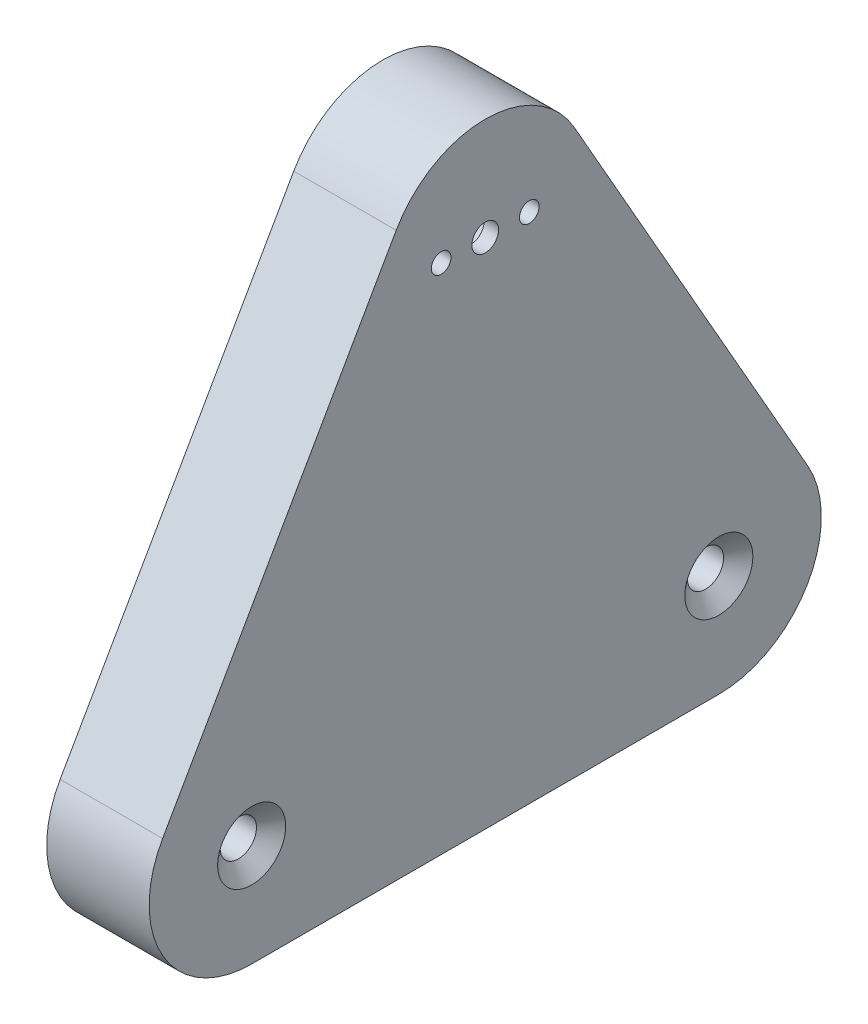
ISO-10303-21;
HEADER;
FILE_DESCRIPTION(('STEP AP214'),'2;1');
FILE_NAME('part.step','',(''),(''),'','','');
FILE_SCHEMA(('AUTOMOTIVE_DESIGN { 1 0 10303 214 1 1 1 1 }'));
ENDSEC;
DATA;
#1=APPLICATION_CONTEXT('core data for automotive mechanical design processes');
#2=APPLICATION_PROTOCOL_DEFINITION('international standard','automotive_design',2000,#1);
#3=PRODUCT_CONTEXT('',#1,'mechanical');
#4=PRODUCT('Part','Part','',(#3));
#5=PRODUCT_RELATED_PRODUCT_CATEGORY('part','',(#4));
#6=PRODUCT_DEFINITION_FORMATION('','',#4);
#7=PRODUCT_DEFINITION_CONTEXT('part definition',#1,'design');
#8=PRODUCT_DEFINITION('design','',#6,#7);
#9=PRODUCT_DEFINITION_SHAPE('','',#8);
#10=(LENGTH_UNIT() NAMED_UNIT(*) SI_UNIT(.MILLI.,.METRE.));
#11=(NAMED_UNIT(*) PLANE_ANGLE_UNIT() SI_UNIT($,.RADIAN.));
#12=(NAMED_UNIT(*) SI_UNIT($,.STERADIAN.) SOLID_ANGLE_UNIT());
#13=UNCERTAINTY_MEASURE_WITH_UNIT(LENGTH_MEASURE(1.E-05),#10,'distance_accuracy_value','');
#14=(GEOMETRIC_REPRESENTATION_CONTEXT(3) GLOBAL_UNCERTAINTY_ASSIGNED_CONTEXT((#13)) GLOBAL_UNIT_ASSIGNED_CONTEXT((#10,
#11,#12)) REPRESENTATION_CONTEXT('',''));
#15=CARTESIAN_POINT('',(0.,0.,0.));
#16=DIRECTION('',(0.,0.,1.));
#17=DIRECTION('',(1.,0.,0.));
#18=AXIS2_PLACEMENT_3D('',#15,#16,#17);
#19=CARTESIAN_POINT('',(3.175,25.4,0.));
#20=DIRECTION('',(1.,0.,0.));
#21=DIRECTION('',(0.,0.,-1.));
#22=AXIS2_PLACEMENT_3D('',#19,#20,#21);
#23=CYLINDRICAL_SURFACE('',#22,12.7);
#24=CARTESIAN_POINT('',(15.875,25.4,0.));
#25=DIRECTION('',(1.,0.,0.));
#26=DIRECTION('',(0.,0.,-1.));
#27=AXIS2_PLACEMENT_3D('',#24,#25,#26);
#28=CIRCLE('',#27,12.7);
#29=CARTESIAN_POINT('',(15.875,31.6874978115392,-11.034372264424));
#30=VERTEX_POINT('',#29);
#31=CARTESIAN_POINT('',(15.875,31.6874978115392,11.034372264424));
#32=VERTEX_POINT('',#31);
#33=EDGE_CURVE('E95',#30,#32,#28,.T.);
#34=ORIENTED_EDGE('',*,*,#33,.F.);
#35=DIRECTION('',(1.,0.,0.));
#36=VECTOR('',#35,1.);
#37=CARTESIAN_POINT('',(-77.1468525682768,31.6874978115392,-11.034372264424));
#38=LINE('',#37,#36);
#39=CARTESIAN_POINT('',(3.175,31.6874978115392,-11.034372264424));
#40=VERTEX_POINT('',#39);
#41=EDGE_CURVE('E99',#40,#30,#38,.T.);
#42=ORIENTED_EDGE('',*,*,#41,.F.);
#43=CARTESIAN_POINT('',(3.175,25.4,0.));
#44=DIRECTION('',(1.,0.,0.));
#45=DIRECTION('',(0.,0.,-1.));
#46=AXIS2_PLACEMENT_3D('',#43,#44,#45);
#47=CIRCLE('',#46,12.7);
#48=CARTESIAN_POINT('',(3.175,31.6874978115392,11.034372264424));
#49=VERTEX_POINT('',#48);
#50=EDGE_CURVE('E112',#40,#49,#47,.T.);
#51=ORIENTED_EDGE('',*,*,#50,.T.);
#52=DIRECTION('',(1.,0.,0.));
#53=VECTOR('',#52,1.);
#54=CARTESIAN_POINT('',(-77.1468525682768,31.6874978115392,11.034372264424));
#55=LINE('',#54,#53);
#56=EDGE_CURVE('E111',#49,#32,#55,.T.);
#57=ORIENTED_EDGE('',*,*,#56,.T.);
#58=EDGE_LOOP('',(#34,#42,#51,#57));
#59=FACE_BOUND('',#58,.T.);
#60=ADVANCED_FACE('F39',(#59),#23,.T.);
#61=CARTESIAN_POINT('',(39.2236659147798,25.4,0.));
#62=DIRECTION('',(-1.,0.,0.));
#63=DIRECTION('',(0.,0.,1.));
#64=AXIS2_PLACEMENT_3D('',#61,#62,#63);
#65=CYLINDRICAL_SURFACE('',#64,8.255);
#66=CARTESIAN_POINT('',(11.5377722,25.4,0.));
#67=DIRECTION('',(-1.,0.,0.));
#68=DIRECTION('',(0.,0.,1.));
#69=AXIS2_PLACEMENT_3D('',#66,#67,#68);
#70=CIRCLE('',#69,8.255);
#71=CARTESIAN_POINT('',(11.5377722,25.4,8.255));
#72=VERTEX_POINT('',#71);
#73=EDGE_CURVE('E127',#72,#72,#70,.F.);
#74=CARTESIAN_POINT('',(8.36277220000001,25.4,0.));
#75=DIRECTION('',(-1.,0.,0.));
#76=DIRECTION('',(0.,0.,1.));
#77=AXIS2_PLACEMENT_3D('',#74,#75,#76);
#78=CIRCLE('',#77,8.255);
#79=CARTESIAN_POINT('',(8.36277220000001,25.4,8.255));
#80=VERTEX_POINT('',#79);
#81=EDGE_CURVE('E128',#80,#80,#78,.F.);
#82=CARTESIAN_POINT('',(11.5377722,25.4,8.255));
#83=CARTESIAN_POINT('',(11.5046992833333,25.4,8.255));
#84=CARTESIAN_POINT('',(11.4716263666667,25.4,8.255));
#85=CARTESIAN_POINT('',(11.4054805333333,25.4,8.255));
#86=CARTESIAN_POINT('',(11.3724076166667,25.4,8.255));
#87=CARTESIAN_POINT('',(11.3062617833333,25.4,8.255));
#88=CARTESIAN_POINT('',(11.2731888666667,25.4,8.255));
#89=CARTESIAN_POINT('',(11.2070430333333,25.4,8.255));
#90=CARTESIAN_POINT('',(11.1739701166667,25.4,8.255));
#91=CARTESIAN_POINT('',(11.1078242833333,25.4,8.255));
#92=CARTESIAN_POINT('',(11.0747513666667,25.4,8.255));
#93=CARTESIAN_POINT('',(11.0086055333333,25.4,8.255));
#94=CARTESIAN_POINT('',(10.9755326166667,25.4,8.255));
#95=CARTESIAN_POINT('',(10.9093867833333,25.4,8.255));
#96=CARTESIAN_POINT('',(10.8763138666667,25.4,8.255));
#97=CARTESIAN_POINT('',(10.8101680333333,25.4,8.255));
#98=CARTESIAN_POINT('',(10.7770951166667,25.4,8.255));
#99=CARTESIAN_POINT('',(10.7109492833333,25.4,8.255));
#100=CARTESIAN_POINT('',(10.6778763666667,25.4,8.255));
#101=CARTESIAN_POINT('',(10.6117305333333,25.4,8.255));
#102=CARTESIAN_POINT('',(10.5786576166667,25.4,8.255));
#103=CARTESIAN_POINT('',(10.5125117833333,25.4,8.255));
#104=CARTESIAN_POINT('',(10.4794388666667,25.4,8.255));
#105=CARTESIAN_POINT('',(10.4132930333333,25.4,8.255));
#106=CARTESIAN_POINT('',(10.3802201166667,25.4,8.255));
#107=CARTESIAN_POINT('',(10.3140742833333,25.4,8.255));
#108=CARTESIAN_POINT('',(10.2810013666667,25.4,8.255));
#109=CARTESIAN_POINT('',(10.2148555333333,25.4,8.255));
#110=CARTESIAN_POINT('',(10.1817826166667,25.4,8.255));
#111=CARTESIAN_POINT('',(10.1156367833333,25.4,8.255));
#112=CARTESIAN_POINT('',(10.0825638666667,25.4,8.255));
#113=CARTESIAN_POINT('',(10.0164180333333,25.4,8.255));
#114=CARTESIAN_POINT('',(9.98334511666667,25.4,8.255));
#115=CARTESIAN_POINT('',(9.91719928333334,25.4,8.255));
#116=CARTESIAN_POINT('',(9.88412636666667,25.4,8.255));
#117=CARTESIAN_POINT('',(9.81798053333334,25.4,8.255));
#118=CARTESIAN_POINT('',(9.78490761666667,25.4,8.255));
#119=CARTESIAN_POINT('',(9.71876178333334,25.4,8.255));
#120=CARTESIAN_POINT('',(9.68568886666667,25.4,8.255));
#121=CARTESIAN_POINT('',(9.61954303333334,25.4,8.255));
#122=CARTESIAN_POINT('',(9.58647011666667,25.4,8.255));
#123=CARTESIAN_POINT('',(9.52032428333334,25.4,8.255));
#124=CARTESIAN_POINT('',(9.48725136666667,25.4,8.255));
#125=CARTESIAN_POINT('',(9.42110553333334,25.4,8.255));
#126=CARTESIAN_POINT('',(9.38803261666667,25.4,8.255));
#127=CARTESIAN_POINT('',(9.32188678333334,25.4,8.255));
#128=CARTESIAN_POINT('',(9.28881386666667,25.4,8.255));
#129=CARTESIAN_POINT('',(9.22266803333334,25.4,8.255));
#130=CARTESIAN_POINT('',(9.18959511666667,25.4,8.255));
#131=CARTESIAN_POINT('',(9.12344928333334,25.4,8.255));
#132=CARTESIAN_POINT('',(9.09037636666667,25.4,8.255));
#133=CARTESIAN_POINT('',(9.02423053333334,25.4,8.255));
#134=CARTESIAN_POINT('',(8.99115761666667,25.4,8.255));
#135=CARTESIAN_POINT('',(8.92501178333334,25.4,8.255));
#136=CARTESIAN_POINT('',(8.89193886666667,25.4,8.255));
#137=CARTESIAN_POINT('',(8.82579303333334,25.4,8.255));
#138=CARTESIAN_POINT('',(8.79272011666667,25.4,8.255));
#139=CARTESIAN_POINT('',(8.72657428333334,25.4,8.255));
#140=CARTESIAN_POINT('',(8.69350136666667,25.4,8.255));
#141=CARTESIAN_POINT('',(8.62735553333334,25.4,8.255));
#142=CARTESIAN_POINT('',(8.59428261666667,25.4,8.255));
#143=CARTESIAN_POINT('',(8.52813678333334,25.4,8.255));
#144=CARTESIAN_POINT('',(8.49506386666667,25.4,8.255));
#145=CARTESIAN_POINT('',(8.42891803333334,25.4,8.255));
#146=CARTESIAN_POINT('',(8.39584511666667,25.4,8.255));
#147=CARTESIAN_POINT('',(8.36277220000001,25.4,8.255));
#148=B_SPLINE_CURVE_WITH_KNOTS('',3,(#82,#83,#84,#85,#86,#87,#88,#89,#90,#91,#92,#93,#94,#95,
#96,#97,#98,#99,#100,#101,#102,#103,#104,#105,#106,#107,#108,#109,#110,#111,#112,#113,#114,#115,
#116,#117,#118,#119,#120,#121,#122,#123,#124,#125,#126,#127,#128,#129,#130,#131,#132,#133,#134,
#135,#136,#137,#138,#139,#140,#141,#142,#143,#144,#145,#146,#147),.UNSPECIFIED.,.F.,.F.,(4,2,2,
2,2,2,2,2,2,2,2,2,2,2,2,2,2,2,2,2,2,2,2,2,2,2,2,2,2,2,2,2,4),(0.,0.0992187500000012,
0.198437499999999,0.29765625,0.396874999999998,0.496093749999999,0.5953125,0.694531249999998,
0.793749999999999,0.892968750000001,0.992187499999998,1.09140625,1.190625,1.28984375,1.3890625,
1.48828125,1.5875,1.68671875,1.7859375,1.88515625,1.984375,2.08359375,2.1828125,2.28203125,
2.38125,2.48046875,2.5796875,2.67890625,2.778125,2.87734375,2.9765625,3.07578125,3.175),.UNSPECIFIED.);
#149=EDGE_CURVE('BSEAM208',#72,#80,#148,.T.);
#150=ORIENTED_EDGE('',*,*,#73,.T.);
#151=ORIENTED_EDGE('',*,*,#81,.F.);
#152=ORIENTED_EDGE('',*,*,#149,.T.);
#153=ORIENTED_EDGE('',*,*,#149,.F.);
#154=EDGE_LOOP('',(#150,#152,#151,#153));
#155=FACE_BOUND('',#154,.T.);
#156=ADVANCED_FACE('F208',(#155),#65,.F.);
#157=CARTESIAN_POINT('',(26.651307345283,25.4,0.));
#158=DIRECTION('',(-1.,0.,0.));
#159=DIRECTION('',(0.,0.,1.));
#160=AXIS2_PLACEMENT_3D('',#157,#158,#159);
#161=CYLINDRICAL_SURFACE('',#160,3.81);
#162=CARTESIAN_POINT('',(14.0777722,25.4,0.));
#163=DIRECTION('',(-1.,0.,0.));
#164=DIRECTION('',(0.,0.,1.));
#165=AXIS2_PLACEMENT_3D('',#162,#163,#164);
#166=CIRCLE('',#165,3.81);
#167=CARTESIAN_POINT('',(14.0777722,25.4,3.81));
#168=VERTEX_POINT('',#167);
#169=EDGE_CURVE('E123',#168,#168,#166,.F.);
#170=CARTESIAN_POINT('',(11.5377722,25.4,0.));
#171=DIRECTION('',(-1.,0.,0.));
#172=DIRECTION('',(0.,0.,1.));
#173=AXIS2_PLACEMENT_3D('',#170,#171,#172);
#174=CIRCLE('',#173,3.81);
#175=CARTESIAN_POINT('',(11.5377722,25.4,3.81));
#176=VERTEX_POINT('',#175);
#177=EDGE_CURVE('E124',#176,#176,#174,.F.);
#178=CARTESIAN_POINT('',(14.0777722,25.4,3.81));
#179=CARTESIAN_POINT('',(14.0513138666667,25.4,3.81));
#180=CARTESIAN_POINT('',(14.0248555333333,25.4,3.81));
#181=CARTESIAN_POINT('',(13.9719388666667,25.4,3.81));
#182=CARTESIAN_POINT('',(13.9454805333333,25.4,3.81));
#183=CARTESIAN_POINT('',(13.8925638666667,25.4,3.81));
#184=CARTESIAN_POINT('',(13.8661055333333,25.4,3.81));
#185=CARTESIAN_POINT('',(13.8131888666667,25.4,3.81));
#186=CARTESIAN_POINT('',(13.7867305333333,25.4,3.81));
#187=CARTESIAN_POINT('',(13.7338138666667,25.4,3.81));
#188=CARTESIAN_POINT('',(13.7073555333333,25.4,3.81));
#189=CARTESIAN_POINT('',(13.6544388666667,25.4,3.81));
#190=CARTESIAN_POINT('',(13.6279805333333,25.4,3.81));
#191=CARTESIAN_POINT('',(13.5750638666667,25.4,3.81));
#192=CARTESIAN_POINT('',(13.5486055333333,25.4,3.81));
#193=CARTESIAN_POINT('',(13.4956888666667,25.4,3.81));
#194=CARTESIAN_POINT('',(13.4692305333333,25.4,3.81));
#195=CARTESIAN_POINT('',(13.4163138666667,25.4,3.81));
#196=CARTESIAN_POINT('',(13.3898555333333,25.4,3.81));
#197=CARTESIAN_POINT('',(13.3369388666667,25.4,3.81));
#198=CARTESIAN_POINT('',(13.3104805333333,25.4,3.81));
#199=CARTESIAN_POINT('',(13.2575638666667,25.4,3.81));
#200=CARTESIAN_POINT('',(13.2311055333333,25.4,3.81));
#201=CARTESIAN_POINT('',(13.1781888666667,25.4,3.81));
#202=CARTESIAN_POINT('',(13.1517305333333,25.4,3.81));
#203=CARTESIAN_POINT('',(13.0988138666667,25.4,3.81));
#204=CARTESIAN_POINT('',(13.0723555333333,25.4,3.81));
#205=CARTESIAN_POINT('',(13.0194388666667,25.4,3.81));
#206=CARTESIAN_POINT('',(12.9929805333333,25.4,3.81));
#207=CARTESIAN_POINT('',(12.9400638666667,25.4,3.81));
#208=CARTESIAN_POINT('',(12.9136055333333,25.4,3.81));
#209=CARTESIAN_POINT('',(12.8606888666667,25.4,3.81));
#210=CARTESIAN_POINT('',(12.8342305333333,25.4,3.81));
#211=CARTESIAN_POINT('',(12.7813138666667,25.4,3.81));
#212=CARTESIAN_POINT('',(12.7548555333333,25.4,3.81));
#213=CARTESIAN_POINT('',(12.7019388666667,25.4,3.81));
#214=CARTESIAN_POINT('',(12.6754805333333,25.4,3.81));
#215=CARTESIAN_POINT('',(12.6225638666667,25.4,3.81));
#216=CARTESIAN_POINT('',(12.5961055333333,25.4,3.81));
#217=CARTESIAN_POINT('',(12.5431888666667,25.4,3.81));
#218=CARTESIAN_POINT('',(12.5167305333333,25.4,3.81));
#219=CARTESIAN_POINT('',(12.4638138666667,25.4,3.81));
#220=CARTESIAN_POINT('',(12.4373555333333,25.4,3.81));
#221=CARTESIAN_POINT('',(12.3844388666667,25.4,3.81));
#222=CARTESIAN_POINT('',(12.3579805333333,25.4,3.81));
#223=CARTESIAN_POINT('',(12.3050638666667,25.4,3.81));
#224=CARTESIAN_POINT('',(12.2786055333333,25.4,3.81));
#225=CARTESIAN_POINT('',(12.2256888666667,25.4,3.81));
#226=CARTESIAN_POINT('',(12.1992305333333,25.4,3.81));
#227=CARTESIAN_POINT('',(12.1463138666667,25.4,3.81));
#228=CARTESIAN_POINT('',(12.1198555333333,25.4,3.81));
#229=CARTESIAN_POINT('',(12.0669388666667,25.4,3.81));
#230=CARTESIAN_POINT('',(12.0404805333333,25.4,3.81));
#231=CARTESIAN_POINT('',(11.9875638666667,25.4,3.81));
#232=CARTESIAN_POINT('',(11.9611055333333,25.4,3.81));
#233=CARTESIAN_POINT('',(11.9081888666667,25.4,3.81));
#234=CARTESIAN_POINT('',(11.8817305333333,25.4,3.81));
#235=CARTESIAN_POINT('',(11.8288138666667,25.4,3.81));
#236=CARTESIAN_POINT('',(11.8023555333333,25.4,3.81));
#237=CARTESIAN_POINT('',(11.7494388666667,25.4,3.81));
#238=CARTESIAN_POINT('',(11.7229805333333,25.4,3.81));
#239=CARTESIAN_POINT('',(11.6700638666667,25.4,3.81));
#240=CARTESIAN_POINT('',(11.6436055333333,25.4,3.81));
#241=CARTESIAN_POINT('',(11.5906888666667,25.4,3.81));
#242=CARTESIAN_POINT('',(11.5642305333333,25.4,3.81));
#243=CARTESIAN_POINT('',(11.5377722,25.4,3.81));
#244=B_SPLINE_CURVE_WITH_KNOTS('',3,(#178,#179,#180,#181,#182,#183,#184,#185,#186,#187,#188,
#189,#190,#191,#192,#193,#194,#195,#196,#197,#198,#199,#200,#201,#202,#203,#204,#205,#206,#207,
#208,#209,#210,#211,#212,#213,#214,#215,#216,#217,#218,#219,#220,#221,#222,#223,#224,#225,#226,
#227,#228,#229,#230,#231,#232,#233,#234,#235,#236,#237,#238,#239,#240,#241,#242,#243),
.UNSPECIFIED.,.F.,.F.,(4,2,2,2,2,2,2,2,2,2,2,2,2,2,2,2,2,2,2,2,2,2,2,2,2,2,2,2,2,2,2,2,4),(0.,
0.0793749999999996,0.158749999999999,0.238125,0.3175,0.396875,0.476249999999999,
0.555624999999999,0.635,0.714375,0.793749999999999,0.873124999999999,0.952499999999998,1.031875,
1.11125,1.190625,1.27,1.349375,1.42875,1.508125,1.5875,1.666875,1.74625,1.825625,1.905,1.984375,
2.06375,2.143125,2.2225,2.301875,2.38125,2.460625,2.54),.UNSPECIFIED.);
#245=EDGE_CURVE('BSEAM187',#168,#176,#244,.T.);
#246=ORIENTED_EDGE('',*,*,#169,.T.);
#247=ORIENTED_EDGE('',*,*,#177,.F.);
#248=ORIENTED_EDGE('',*,*,#245,.T.);
#249=ORIENTED_EDGE('',*,*,#245,.F.);
#250=EDGE_LOOP('',(#246,#248,#247,#249));
#251=FACE_BOUND('',#250,.T.);
#252=ADVANCED_FACE('F187',(#251),#161,.F.);
#253=CARTESIAN_POINT('',(20.544733182956,25.4,0.));
#254=DIRECTION('',(-1.,0.,0.));
#255=DIRECTION('',(0.,0.,1.));
#256=AXIS2_PLACEMENT_3D('',#253,#254,#255);
#257=CYLINDRICAL_SURFACE('',#256,1.651);
#258=CARTESIAN_POINT('',(15.875,25.4,0.));
#259=DIRECTION('',(-1.,0.,0.));
#260=DIRECTION('',(0.,0.,1.));
#261=AXIS2_PLACEMENT_3D('',#258,#259,#260);
#262=CIRCLE('',#261,1.651);
#263=CARTESIAN_POINT('',(15.875,25.4,1.651));
#264=VERTEX_POINT('',#263);
#265=EDGE_CURVE('E113',#264,#264,#262,.F.);
#266=CARTESIAN_POINT('',(14.0777722,25.4,0.));
#267=DIRECTION('',(-1.,0.,0.));
#268=DIRECTION('',(0.,0.,1.));
#269=AXIS2_PLACEMENT_3D('',#266,#267,#268);
#270=CIRCLE('',#269,1.651);
#271=CARTESIAN_POINT('',(14.0777722,25.4,1.651));
#272=VERTEX_POINT('',#271);
#273=EDGE_CURVE('E118',#272,#272,#270,.F.);
#274=CARTESIAN_POINT('',(15.875,25.4,1.651));
#275=CARTESIAN_POINT('',(15.8562788770833,25.4,1.651));
#276=CARTESIAN_POINT('',(15.8375577541667,25.4,1.651));
#277=CARTESIAN_POINT('',(15.8001155083333,25.4,1.651));
#278=CARTESIAN_POINT('',(15.7813943854167,25.4,1.651));
#279=CARTESIAN_POINT('',(15.7439521395833,25.4,1.651));
#280=CARTESIAN_POINT('',(15.7252310166667,25.4,1.651));
#281=CARTESIAN_POINT('',(15.6877887708333,25.4,1.651));
#282=CARTESIAN_POINT('',(15.6690676479167,25.4,1.651));
#283=CARTESIAN_POINT('',(15.6316254020833,25.4,1.651));
#284=CARTESIAN_POINT('',(15.6129042791667,25.4,1.651));
#285=CARTESIAN_POINT('',(15.5754620333333,25.4,1.651));
#286=CARTESIAN_POINT('',(15.5567409104167,25.4,1.651));
#287=CARTESIAN_POINT('',(15.5192986645833,25.4,1.651));
#288=CARTESIAN_POINT('',(15.5005775416667,25.4,1.651));
#289=CARTESIAN_POINT('',(15.4631352958333,25.4,1.651));
#290=CARTESIAN_POINT('',(15.4444141729167,25.4,1.651));
#291=CARTESIAN_POINT('',(15.4069719270833,25.4,1.651));
#292=CARTESIAN_POINT('',(15.3882508041667,25.4,1.651));
#293=CARTESIAN_POINT('',(15.3508085583333,25.4,1.651));
#294=CARTESIAN_POINT('',(15.3320874354167,25.4,1.651));
#295=CARTESIAN_POINT('',(15.2946451895833,25.4,1.651));
#296=CARTESIAN_POINT('',(15.2759240666667,25.4,1.651));
#297=CARTESIAN_POINT('',(15.2384818208333,25.4,1.651));
#298=CARTESIAN_POINT('',(15.2197606979167,25.4,1.651));
#299=CARTESIAN_POINT('',(15.1823184520833,25.4,1.651));
#300=CARTESIAN_POINT('',(15.1635973291667,25.4,1.651));
#301=CARTESIAN_POINT('',(15.1261550833333,25.4,1.651));
#302=CARTESIAN_POINT('',(15.1074339604167,25.4,1.651));
#303=CARTESIAN_POINT('',(15.0699917145833,25.4,1.651));
#304=CARTESIAN_POINT('',(15.0512705916667,25.4,1.651));
#305=CARTESIAN_POINT('',(15.0138283458333,25.4,1.651));
#306=CARTESIAN_POINT('',(14.9951072229167,25.4,1.651));
#307=CARTESIAN_POINT('',(14.9576649770833,25.4,1.651));
#308=CARTESIAN_POINT('',(14.9389438541667,25.4,1.651));
#309=CARTESIAN_POINT('',(14.9015016083333,25.4,1.651));
#310=CARTESIAN_POINT('',(14.8827804854167,25.4,1.651));
#311=CARTESIAN_POINT('',(14.8453382395833,25.4,1.651));
#312=CARTESIAN_POINT('',(14.8266171166667,25.4,1.651));
#313=CARTESIAN_POINT('',(14.7891748708333,25.4,1.651));
#314=CARTESIAN_POINT('',(14.7704537479167,25.4,1.651));
#315=CARTESIAN_POINT('',(14.7330115020833,25.4,1.651));
#316=CARTESIAN_POINT('',(14.7142903791667,25.4,1.651));
#317=CARTESIAN_POINT('',(14.6768481333333,25.4,1.651));
#318=CARTESIAN_POINT('',(14.6581270104167,25.4,1.651));
#319=CARTESIAN_POINT('',(14.6206847645833,25.4,1.651));
#320=CARTESIAN_POINT('',(14.6019636416667,25.4,1.651));
#321=CARTESIAN_POINT('',(14.5645213958333,25.4,1.651));
#322=CARTESIAN_POINT('',(14.5458002729167,25.4,1.651));
#323=CARTESIAN_POINT('',(14.5083580270833,25.4,1.651));
#324=CARTESIAN_POINT('',(14.4896369041667,25.4,1.651));
#325=CARTESIAN_POINT('',(14.4521946583333,25.4,1.651));
#326=CARTESIAN_POINT('',(14.4334735354167,25.4,1.651));
#327=CARTESIAN_POINT('',(14.3960312895833,25.4,1.651));
#328=CARTESIAN_POINT('',(14.3773101666667,25.4,1.651));
#329=CARTESIAN_POINT('',(14.3398679208333,25.4,1.651));
#330=CARTESIAN_POINT('',(14.3211467979167,25.4,1.651));
#331=CARTESIAN_POINT('',(14.2837045520833,25.4,1.651));
#332=CARTESIAN_POINT('',(14.2649834291667,25.4,1.651));
#333=CARTESIAN_POINT('',(14.2275411833333,25.4,1.651));
#334=CARTESIAN_POINT('',(14.2088200604167,25.4,1.651));
#335=CARTESIAN_POINT('',(14.1713778145833,25.4,1.651));
#336=CARTESIAN_POINT('',(14.1526566916667,25.4,1.651));
#337=CARTESIAN_POINT('',(14.1152144458333,25.4,1.651));
#338=CARTESIAN_POINT('',(14.0964933229167,25.4,1.651));
#339=CARTESIAN_POINT('',(14.0777722,25.4,1.651));
#340=B_SPLINE_CURVE_WITH_KNOTS('',3,(#274,#275,#276,#277,#278,#279,#280,#281,#282,#283,#284,
#285,#286,#287,#288,#289,#290,#291,#292,#293,#294,#295,#296,#297,#298,#299,#300,#301,#302,#303,
#304,#305,#306,#307,#308,#309,#310,#311,#312,#313,#314,#315,#316,#317,#318,#319,#320,#321,#322,
#323,#324,#325,#326,#327,#328,#329,#330,#331,#332,#333,#334,#335,#336,#337,#338,#339),
.UNSPECIFIED.,.F.,.F.,(4,2,2,2,2,2,2,2,2,2,2,2,2,2,2,2,2,2,2,2,2,2,2,2,2,2,2,2,2,2,2,2,4),(0.,
0.0561633687500007,0.112326737500001,0.168490106250002,0.224653475000003,0.280816843750002,
0.336980212500003,0.393143581250002,0.449306950000002,0.505470318750003,0.561633687500002,
0.617797056250003,0.673960425000002,0.730123793750002,0.786287162500003,0.842450531250004,
0.898613900000003,0.954777268750002,1.0109406375,1.06710400625,1.123267375,1.17943074375,
1.2355941125,1.29175748125,1.34792085,1.40408421875,1.4602475875,1.51641095625,1.572574325,
1.62873769375,1.6849010625,1.74106443125,1.7972278),.UNSPECIFIED.);
#341=EDGE_CURVE('BSEAM197',#264,#272,#340,.T.);
#342=ORIENTED_EDGE('',*,*,#265,.T.);
#343=ORIENTED_EDGE('',*,*,#273,.F.);
#344=ORIENTED_EDGE('',*,*,#341,.T.);
#345=ORIENTED_EDGE('',*,*,#341,.F.);
#346=EDGE_LOOP('',(#342,#344,#343,#345));
#347=FACE_BOUND('',#346,.T.);
#348=ADVANCED_FACE('F197',(#347),#257,.F.);
#349=CARTESIAN_POINT('',(15.875,-29.9528900942797,0.));
#350=DIRECTION('',(-1.,0.,0.));
#351=DIRECTION('',(0.,0.,1.));
#352=AXIS2_PLACEMENT_3D('',#349,#350,#351);
#353=PLANE('',#352);
#354=CARTESIAN_POINT('',(15.875,-25.4,-28.9463579052872));
#355=DIRECTION('',(1.,0.,0.));
#356=DIRECTION('',(0.,0.,-1.));
#357=AXIS2_PLACEMENT_3D('',#354,#355,#356);
#358=CIRCLE('',#357,4.2164);
#359=CARTESIAN_POINT('',(15.875,-25.4,-33.1627579052872));
#360=VERTEX_POINT('',#359);
#361=EDGE_CURVE('E364',#360,#360,#358,.T.);
#362=ORIENTED_EDGE('',*,*,#361,.F.);
#363=EDGE_LOOP('',(#362));
#364=FACE_BOUND('',#363,.T.);
#365=CARTESIAN_POINT('',(15.875,-25.4,28.9463579052872));
#366=DIRECTION('',(1.,0.,0.));
#367=DIRECTION('',(0.,0.,-1.));
#368=AXIS2_PLACEMENT_3D('',#365,#366,#367);
#369=CIRCLE('',#368,4.2164);
#370=CARTESIAN_POINT('',(15.875,-25.4,24.7299579052872));
#371=VERTEX_POINT('',#370);
#372=EDGE_CURVE('E371',#371,#371,#369,.T.);
#373=ORIENTED_EDGE('',*,*,#372,.F.);
#374=EDGE_LOOP('',(#373));
#375=FACE_BOUND('',#374,.T.);
#376=CARTESIAN_POINT('',(15.875,25.4,-5.4599967));
#377=DIRECTION('',(-1.,0.,0.));
#378=DIRECTION('',(0.,0.,1.));
#379=AXIS2_PLACEMENT_3D('',#376,#377,#378);
#380=CIRCLE('',#379,1.2192);
#381=CARTESIAN_POINT('',(15.875,25.4,-4.2407967));
#382=VERTEX_POINT('',#381);
#383=EDGE_CURVE('E164',#382,#382,#380,.F.);
#384=ORIENTED_EDGE('',*,*,#383,.F.);
#385=EDGE_LOOP('',(#384));
#386=FACE_BOUND('',#385,.T.);
#387=CARTESIAN_POINT('',(15.875,25.4,5.4599967));
#388=DIRECTION('',(-1.,0.,0.));
#389=DIRECTION('',(0.,0.,1.));
#390=AXIS2_PLACEMENT_3D('',#387,#388,#389);
#391=CIRCLE('',#390,1.2192);
#392=CARTESIAN_POINT('',(15.875,25.4,6.6791967));
#393=VERTEX_POINT('',#392);
#394=EDGE_CURVE('E174',#393,#393,#391,.F.);
#395=ORIENTED_EDGE('',*,*,#394,.F.);
#396=EDGE_LOOP('',(#395));
#397=FACE_BOUND('',#396,.T.);
#398=ORIENTED_EDGE('',*,*,#265,.F.);
#399=EDGE_LOOP('',(#398));
#400=FACE_BOUND('',#399,.T.);
#401=DIRECTION('',(0.,-0.868848209797166,0.495078567837732));
#402=VECTOR('',#401,1.);
#403=CARTESIAN_POINT('',(15.875,12.5131086351786,21.9601346997429));
#404=LINE('',#403,#402);
#405=CARTESIAN_POINT('',(15.875,-19.1125021884608,39.9807301697112));
#406=VERTEX_POINT('',#405);
#407=EDGE_CURVE('E157',#32,#406,#404,.T.);
#408=ORIENTED_EDGE('',*,*,#407,.T.);
#409=CARTESIAN_POINT('',(15.875,-25.4,28.9463579052872));
#410=DIRECTION('',(-1.,0.,0.));
#411=DIRECTION('',(0.,0.,1.));
#412=AXIS2_PLACEMENT_3D('',#409,#410,#411);
#413=CIRCLE('',#412,12.7);
#414=CARTESIAN_POINT('',(15.875,-38.1,28.9463579052872));
#415=VERTEX_POINT('',#414);
#416=EDGE_CURVE('E135',#406,#415,#413,.F.);
#417=ORIENTED_EDGE('',*,*,#416,.T.);
#418=DIRECTION('',(0.,0.,1.));
#419=VECTOR('',#418,1.);
#420=CARTESIAN_POINT('',(15.875,-38.1,12.7));
#421=LINE('',#420,#419);
#422=CARTESIAN_POINT('',(15.875,-38.1,-28.9463579052872));
#423=VERTEX_POINT('',#422);
#424=EDGE_CURVE('E156',#423,#415,#421,.T.);
#425=ORIENTED_EDGE('',*,*,#424,.F.);
#426=CARTESIAN_POINT('',(15.875,-25.4,-28.9463579052872));
#427=DIRECTION('',(-1.,0.,0.));
#428=DIRECTION('',(0.,0.,1.));
#429=AXIS2_PLACEMENT_3D('',#426,#427,#428);
#430=CIRCLE('',#429,12.7);
#431=CARTESIAN_POINT('',(15.875,-19.1125021884608,-39.9807301697112));
#432=VERTEX_POINT('',#431);
#433=EDGE_CURVE('E98',#423,#432,#430,.F.);
#434=ORIENTED_EDGE('',*,*,#433,.T.);
#435=DIRECTION('',(0.,0.868848209797166,0.495078567837733));
#436=VECTOR('',#435,1.);
#437=CARTESIAN_POINT('',(15.875,12.5131086351786,-21.9601346997429));
#438=LINE('',#437,#436);
#439=EDGE_CURVE('E90',#432,#30,#438,.T.);
#440=ORIENTED_EDGE('',*,*,#439,.T.);
#441=ORIENTED_EDGE('',*,*,#33,.T.);
#442=EDGE_LOOP('',(#408,#417,#425,#434,#440,#441));
#443=FACE_BOUND('',#442,.T.);
#444=ADVANCED_FACE('F93',(#364,#375,#386,#397,#400,#443),#353,.F.);
#445=CARTESIAN_POINT('',(3.175,0.,0.));
#446=DIRECTION('',(1.,0.,0.));
#447=DIRECTION('',(0.,0.,-1.));
#448=AXIS2_PLACEMENT_3D('',#445,#446,#447);
#449=PLANE('',#448);
#450=CARTESIAN_POINT('',(3.175,-25.4,-28.9463579052872));
#451=DIRECTION('',(1.,0.,0.));
#452=DIRECTION('',(0.,0.,-1.));
#453=AXIS2_PLACEMENT_3D('',#450,#451,#452);
#454=CIRCLE('',#453,2.2479);
#455=CARTESIAN_POINT('',(3.175,-25.4,-31.1942579052872));
#456=VERTEX_POINT('',#455);
#457=EDGE_CURVE('E366',#456,#456,#454,.T.);
#458=ORIENTED_EDGE('',*,*,#457,.T.);
#459=EDGE_LOOP('',(#458));
#460=FACE_BOUND('',#459,.T.);
#461=CARTESIAN_POINT('',(3.175,-25.4,28.9463579052872));
#462=DIRECTION('',(1.,0.,0.));
#463=DIRECTION('',(0.,0.,-1.));
#464=AXIS2_PLACEMENT_3D('',#461,#462,#463);
#465=CIRCLE('',#464,2.2479);
#466=CARTESIAN_POINT('',(3.175,-25.4,26.6984579052872));
#467=VERTEX_POINT('',#466);
#468=EDGE_CURVE('E100',#467,#467,#465,.T.);
#469=ORIENTED_EDGE('',*,*,#468,.T.);
#470=EDGE_LOOP('',(#469));
#471=FACE_BOUND('',#470,.T.);
#472=DIRECTION('',(0.,0.,-1.));
#473=VECTOR('',#472,1.);
#474=CARTESIAN_POINT('',(3.175,-38.1,12.7));
#475=LINE('',#474,#473);
#476=CARTESIAN_POINT('',(3.175,-38.1,28.9463579052872));
#477=VERTEX_POINT('',#476);
#478=CARTESIAN_POINT('',(3.175,-38.1,-28.9463579052872));
#479=VERTEX_POINT('',#478);
#480=EDGE_CURVE('E147',#477,#479,#475,.T.);
#481=ORIENTED_EDGE('',*,*,#480,.F.);
#482=CARTESIAN_POINT('',(3.175,-25.4,28.9463579052872));
#483=DIRECTION('',(1.,0.,0.));
#484=DIRECTION('',(0.,0.,-1.));
#485=AXIS2_PLACEMENT_3D('',#482,#483,#484);
#486=CIRCLE('',#485,12.7);
#487=CARTESIAN_POINT('',(3.175,-19.1125021884608,39.9807301697112));
#488=VERTEX_POINT('',#487);
#489=EDGE_CURVE('E47',#477,#488,#486,.F.);
#490=ORIENTED_EDGE('',*,*,#489,.T.);
#491=DIRECTION('',(0.,0.868848209797166,-0.495078567837732));
#492=VECTOR('',#491,1.);
#493=CARTESIAN_POINT('',(3.175,12.5131086351786,21.9601346997429));
#494=LINE('',#493,#492);
#495=EDGE_CURVE('E146',#488,#49,#494,.T.);
#496=ORIENTED_EDGE('',*,*,#495,.T.);
#497=ORIENTED_EDGE('',*,*,#50,.F.);
#498=DIRECTION('',(0.,-0.868848209797166,-0.495078567837733));
#499=VECTOR('',#498,1.);
#500=CARTESIAN_POINT('',(3.175,12.5131086351786,-21.9601346997429));
#501=LINE('',#500,#499);
#502=CARTESIAN_POINT('',(3.175,-19.1125021884608,-39.9807301697112));
#503=VERTEX_POINT('',#502);
#504=EDGE_CURVE('E104',#40,#503,#501,.T.);
#505=ORIENTED_EDGE('',*,*,#504,.T.);
#506=CARTESIAN_POINT('',(3.175,-25.4,-28.9463579052872));
#507=DIRECTION('',(1.,0.,0.));
#508=DIRECTION('',(0.,0.,-1.));
#509=AXIS2_PLACEMENT_3D('',#506,#507,#508);
#510=CIRCLE('',#509,12.7);
#511=EDGE_CURVE('E59',#503,#479,#510,.F.);
#512=ORIENTED_EDGE('',*,*,#511,.T.);
#513=EDGE_LOOP('',(#481,#490,#496,#497,#505,#512));
#514=FACE_BOUND('',#513,.T.);
#515=CARTESIAN_POINT('',(3.175,25.4,0.));
#516=DIRECTION('',(-1.,0.,0.));
#517=DIRECTION('',(0.,0.,1.));
#518=AXIS2_PLACEMENT_3D('',#515,#516,#517);
#519=CIRCLE('',#518,9.525);
#520=CARTESIAN_POINT('',(3.175,25.4,9.525));
#521=VERTEX_POINT('',#520);
#522=EDGE_CURVE('E177',#521,#521,#519,.T.);
#523=ORIENTED_EDGE('',*,*,#522,.F.);
#524=EDGE_LOOP('',(#523));
#525=FACE_BOUND('',#524,.T.);
#526=ADVANCED_FACE('F144',(#460,#471,#514,#525),#449,.F.);
#527=CARTESIAN_POINT('',(14.0777722,-29.9528900942797,0.));
#528=DIRECTION('',(-1.,0.,0.));
#529=DIRECTION('',(0.,0.,1.));
#530=AXIS2_PLACEMENT_3D('',#527,#528,#529);
#531=PLANE('',#530);
#532=ORIENTED_EDGE('',*,*,#169,.F.);
#533=EDGE_LOOP('',(#532));
#534=FACE_BOUND('',#533,.T.);
#535=ORIENTED_EDGE('',*,*,#273,.T.);
#536=EDGE_LOOP('',(#535));
#537=FACE_BOUND('',#536,.T.);
#538=ADVANCED_FACE('F190',(#534,#537),#531,.T.);
#539=CARTESIAN_POINT('',(11.5377722,-29.9528900942797,0.));
#540=DIRECTION('',(-1.,0.,0.));
#541=DIRECTION('',(0.,0.,1.));
#542=AXIS2_PLACEMENT_3D('',#539,#540,#541);
#543=PLANE('',#542);
#544=CARTESIAN_POINT('',(11.5377722,25.4,-5.4599967));
#545=DIRECTION('',(-1.,0.,0.));
#546=DIRECTION('',(0.,0.,1.));
#547=AXIS2_PLACEMENT_3D('',#544,#545,#546);
#548=CIRCLE('',#547,1.2192);
#549=CARTESIAN_POINT('',(11.5377722,25.4,-4.2407967));
#550=VERTEX_POINT('',#549);
#551=EDGE_CURVE('E161',#550,#550,#548,.T.);
#552=ORIENTED_EDGE('',*,*,#551,.F.);
#553=EDGE_LOOP('',(#552));
#554=FACE_BOUND('',#553,.T.);
#555=CARTESIAN_POINT('',(11.5377722,25.4,5.4599967));
#556=DIRECTION('',(-1.,0.,0.));
#557=DIRECTION('',(0.,0.,1.));
#558=AXIS2_PLACEMENT_3D('',#555,#556,#557);
#559=CIRCLE('',#558,1.2192);
#560=CARTESIAN_POINT('',(11.5377722,25.4,6.6791967));
#561=VERTEX_POINT('',#560);
#562=EDGE_CURVE('E171',#561,#561,#559,.T.);
#563=ORIENTED_EDGE('',*,*,#562,.F.);
#564=EDGE_LOOP('',(#563));
#565=FACE_BOUND('',#564,.T.);
#566=ORIENTED_EDGE('',*,*,#73,.F.);
#567=EDGE_LOOP('',(#566));
#568=FACE_BOUND('',#567,.T.);
#569=ORIENTED_EDGE('',*,*,#177,.T.);
#570=EDGE_LOOP('',(#569));
#571=FACE_BOUND('',#570,.T.);
#572=ADVANCED_FACE('F193',(#554,#565,#568,#571),#543,.T.);
#573=CARTESIAN_POINT('',(8.36277220000001,-29.9528900942797,0.));
#574=DIRECTION('',(-1.,0.,0.));
#575=DIRECTION('',(0.,0.,1.));
#576=AXIS2_PLACEMENT_3D('',#573,#574,#575);
#577=PLANE('',#576);
#578=CARTESIAN_POINT('',(8.36277220000001,25.4,0.));
#579=DIRECTION('',(-1.,0.,0.));
#580=DIRECTION('',(0.,0.,1.));
#581=AXIS2_PLACEMENT_3D('',#578,#579,#580);
#582=CIRCLE('',#581,9.525);
#583=CARTESIAN_POINT('',(8.36277220000001,25.4,9.525));
#584=VERTEX_POINT('',#583);
#585=EDGE_CURVE('E131',#584,#584,#582,.F.);
#586=ORIENTED_EDGE('',*,*,#585,.F.);
#587=EDGE_LOOP('',(#586));
#588=FACE_BOUND('',#587,.T.);
#589=ORIENTED_EDGE('',*,*,#81,.T.);
#590=EDGE_LOOP('',(#589));
#591=FACE_BOUND('',#590,.T.);
#592=ADVANCED_FACE('F244',(#588,#591),#577,.T.);
#593=CARTESIAN_POINT('',(42.8157683632075,25.4,0.));
#594=DIRECTION('',(-1.,0.,0.));
#595=DIRECTION('',(0.,0.,1.));
#596=AXIS2_PLACEMENT_3D('',#593,#594,#595);
#597=CYLINDRICAL_SURFACE('',#596,9.525);
#598=CARTESIAN_POINT('',(8.36277220000001,25.4,9.525));
#599=CARTESIAN_POINT('',(8.30873290625001,25.4,9.525));
#600=CARTESIAN_POINT('',(8.25469361250001,25.4,9.525));
#601=CARTESIAN_POINT('',(8.14661502500001,25.4,9.525));
#602=CARTESIAN_POINT('',(8.09257573125002,25.4,9.525));
#603=CARTESIAN_POINT('',(7.98449714375001,25.4,9.525));
#604=CARTESIAN_POINT('',(7.93045785000001,25.4,9.525));
#605=CARTESIAN_POINT('',(7.82237926250001,25.4,9.525));
#606=CARTESIAN_POINT('',(7.76833996875001,25.4,9.525));
#607=CARTESIAN_POINT('',(7.66026138125001,25.4,9.525));
#608=CARTESIAN_POINT('',(7.60622208750001,25.4,9.525));
#609=CARTESIAN_POINT('',(7.49814350000002,25.4,9.525));
#610=CARTESIAN_POINT('',(7.44410420625001,25.4,9.525));
#611=CARTESIAN_POINT('',(7.33602561875002,25.4,9.525));
#612=CARTESIAN_POINT('',(7.28198632500001,25.4,9.525));
#613=CARTESIAN_POINT('',(7.17390773750002,25.4,9.525));
#614=CARTESIAN_POINT('',(7.11986844375001,25.4,9.525));
#615=CARTESIAN_POINT('',(7.01178985625001,25.4,9.525));
#616=CARTESIAN_POINT('',(6.95775056250001,25.4,9.525));
#617=CARTESIAN_POINT('',(6.84967197500001,25.4,9.525));
#618=CARTESIAN_POINT('',(6.79563268125001,25.4,9.525));
#619=CARTESIAN_POINT('',(6.68755409375001,25.4,9.525));
#620=CARTESIAN_POINT('',(6.63351480000001,25.4,9.525));
#621=CARTESIAN_POINT('',(6.52543621250001,25.4,9.525));
#622=CARTESIAN_POINT('',(6.47139691875001,25.4,9.525));
#623=CARTESIAN_POINT('',(6.36331833125001,25.4,9.525));
#624=CARTESIAN_POINT('',(6.30927903750001,25.4,9.525));
#625=CARTESIAN_POINT('',(6.20120045000001,25.4,9.525));
#626=CARTESIAN_POINT('',(6.14716115625001,25.4,9.525));
#627=CARTESIAN_POINT('',(6.03908256875001,25.4,9.525));
#628=CARTESIAN_POINT('',(5.98504327500001,25.4,9.525));
#629=CARTESIAN_POINT('',(5.87696468750001,25.4,9.525));
#630=CARTESIAN_POINT('',(5.82292539375001,25.4,9.525));
#631=CARTESIAN_POINT('',(5.71484680625001,25.4,9.525));
#632=CARTESIAN_POINT('',(5.66080751250001,25.4,9.525));
#633=CARTESIAN_POINT('',(5.55272892500001,25.4,9.525));
#634=CARTESIAN_POINT('',(5.49868963125001,25.4,9.525));
#635=CARTESIAN_POINT('',(5.39061104375001,25.4,9.525));
#636=CARTESIAN_POINT('',(5.33657175000001,25.4,9.525));
#637=CARTESIAN_POINT('',(5.22849316250001,25.4,9.525));
#638=CARTESIAN_POINT('',(5.17445386875001,25.4,9.525));
#639=CARTESIAN_POINT('',(5.06637528125001,25.4,9.525));
#640=CARTESIAN_POINT('',(5.01233598750001,25.4,9.525));
#641=CARTESIAN_POINT('',(4.90425740000001,25.4,9.525));
#642=CARTESIAN_POINT('',(4.85021810625001,25.4,9.525));
#643=CARTESIAN_POINT('',(4.74213951875001,25.4,9.525));
#644=CARTESIAN_POINT('',(4.68810022500001,25.4,9.525));
#645=CARTESIAN_POINT('',(4.58002163750001,25.4,9.525));
#646=CARTESIAN_POINT('',(4.52598234375001,25.4,9.525));
#647=CARTESIAN_POINT('',(4.41790375625001,25.4,9.525));
#648=CARTESIAN_POINT('',(4.36386446250001,25.4,9.525));
#649=CARTESIAN_POINT('',(4.25578587500001,25.4,9.525));
#650=CARTESIAN_POINT('',(4.20174658125001,25.4,9.525));
#651=CARTESIAN_POINT('',(4.09366799375,25.4,9.525));
#652=CARTESIAN_POINT('',(4.0396287,25.4,9.525));
#653=CARTESIAN_POINT('',(3.9315501125,25.4,9.525));
#654=CARTESIAN_POINT('',(3.87751081875,25.4,9.525));
#655=CARTESIAN_POINT('',(3.76943223125,25.4,9.525));
#656=CARTESIAN_POINT('',(3.7153929375,25.4,9.525));
#657=CARTESIAN_POINT('',(3.60731435,25.4,9.525));
#658=CARTESIAN_POINT('',(3.55327505625,25.4,9.525));
#659=CARTESIAN_POINT('',(3.44519646875,25.4,9.525));
#660=CARTESIAN_POINT('',(3.391157175,25.4,9.525));
#661=CARTESIAN_POINT('',(3.2830785875,25.4,9.525));
#662=CARTESIAN_POINT('',(3.22903929375,25.4,9.525));
#663=CARTESIAN_POINT('',(3.175,25.4,9.525));
#664=B_SPLINE_CURVE_WITH_KNOTS('',3,(#598,#599,#600,#601,#602,#603,#604,#605,#606,#607,#608,
#609,#610,#611,#612,#613,#614,#615,#616,#617,#618,#619,#620,#621,#622,#623,#624,#625,#626,#627,
#628,#629,#630,#631,#632,#633,#634,#635,#636,#637,#638,#639,#640,#641,#642,#643,#644,#645,#646,
#647,#648,#649,#650,#651,#652,#653,#654,#655,#656,#657,#658,#659,#660,#661,#662,#663),
.UNSPECIFIED.,.F.,.F.,(4,2,2,2,2,2,2,2,2,2,2,2,2,2,2,2,2,2,2,2,2,2,2,2,2,2,2,2,2,2,2,2,4),(0.,
0.16211788125,0.3242357625,0.48635364375,0.648471524999999,0.810589406249999,0.972707287499999,
1.13482516875,1.29694305,1.45906093125001,1.62117881250001,1.78329669375001,1.94541457500001,
2.10753245625001,2.26965033750001,2.43176821875001,2.59388610000001,2.75600398125,2.9181218625,
3.08023974375,3.242357625,3.40447550625,3.5665933875,3.72871126875,3.89082915000001,
4.05294703125,4.21506491250001,4.37718279375001,4.53930067500001,4.70141855625001,
4.86353643750001,5.02565431875001,5.18777220000001),.UNSPECIFIED.);
#665=EDGE_CURVE('BSEAM242',#584,#521,#664,.T.);
#666=ORIENTED_EDGE('',*,*,#585,.T.);
#667=ORIENTED_EDGE('',*,*,#522,.T.);
#668=ORIENTED_EDGE('',*,*,#665,.T.);
#669=ORIENTED_EDGE('',*,*,#665,.F.);
#670=EDGE_LOOP('',(#666,#668,#667,#669));
#671=FACE_BOUND('',#670,.T.);
#672=ADVANCED_FACE('F242',(#671),#597,.F.);
#673=CARTESIAN_POINT('',(19.3234183504906,25.4,5.4599967));
#674=DIRECTION('',(-1.,0.,0.));
#675=DIRECTION('',(0.,0.,1.));
#676=AXIS2_PLACEMENT_3D('',#673,#674,#675);
#677=CYLINDRICAL_SURFACE('',#676,1.2192);
#678=ORIENTED_EDGE('',*,*,#394,.T.);
#679=EDGE_LOOP('',(#678));
#680=FACE_BOUND('',#679,.T.);
#681=ORIENTED_EDGE('',*,*,#562,.T.);
#682=EDGE_LOOP('',(#681));
#683=FACE_BOUND('',#682,.T.);
#684=ADVANCED_FACE('F238',(#680,#683),#677,.F.);
#685=CARTESIAN_POINT('',(19.3234183504906,25.4,-5.4599967));
#686=DIRECTION('',(-1.,0.,0.));
#687=DIRECTION('',(0.,0.,1.));
#688=AXIS2_PLACEMENT_3D('',#685,#686,#687);
#689=CYLINDRICAL_SURFACE('',#688,1.2192);
#690=ORIENTED_EDGE('',*,*,#383,.T.);
#691=EDGE_LOOP('',(#690));
#692=FACE_BOUND('',#691,.T.);
#693=ORIENTED_EDGE('',*,*,#551,.T.);
#694=EDGE_LOOP('',(#693));
#695=FACE_BOUND('',#694,.T.);
#696=ADVANCED_FACE('F235',(#692,#695),#689,.F.);
#697=CARTESIAN_POINT('',(0.,-38.1,0.));
#698=DIRECTION('',(0.,-1.,0.));
#699=DIRECTION('',(0.,0.,-1.));
#700=AXIS2_PLACEMENT_3D('',#697,#698,#699);
#701=PLANE('',#700);
#702=ORIENTED_EDGE('',*,*,#424,.T.);
#703=DIRECTION('',(1.,0.,0.));
#704=VECTOR('',#703,1.);
#705=CARTESIAN_POINT('',(0.,-38.1,28.9463579052872));
#706=LINE('',#705,#704);
#707=EDGE_CURVE('E140',#415,#477,#706,.F.);
#708=ORIENTED_EDGE('',*,*,#707,.T.);
#709=ORIENTED_EDGE('',*,*,#480,.T.);
#710=DIRECTION('',(1.,0.,0.));
#711=VECTOR('',#710,1.);
#712=CARTESIAN_POINT('',(0.,-38.1,-28.9463579052872));
#713=LINE('',#712,#711);
#714=EDGE_CURVE('E137',#479,#423,#713,.T.);
#715=ORIENTED_EDGE('',*,*,#714,.T.);
#716=EDGE_LOOP('',(#702,#708,#709,#715));
#717=FACE_BOUND('',#716,.T.);
#718=ADVANCED_FACE('F159',(#717),#701,.T.);
#719=CARTESIAN_POINT('',(-77.1468525682768,12.5131086351786,21.9601346997429));
#720=DIRECTION('',(0.,0.495078567837732,0.868848209797166));
#721=DIRECTION('',(0.,-0.868848209797166,0.495078567837732));
#722=AXIS2_PLACEMENT_3D('',#719,#720,#721);
#723=PLANE('',#722);
#724=ORIENTED_EDGE('',*,*,#495,.F.);
#725=DIRECTION('',(1.,0.,0.));
#726=VECTOR('',#725,1.);
#727=CARTESIAN_POINT('',(-77.1468525682768,-19.1125021884608,39.9807301697112));
#728=LINE('',#727,#726);
#729=EDGE_CURVE('E115',#488,#406,#728,.T.);
#730=ORIENTED_EDGE('',*,*,#729,.T.);
#731=ORIENTED_EDGE('',*,*,#407,.F.);
#732=ORIENTED_EDGE('',*,*,#56,.F.);
#733=EDGE_LOOP('',(#724,#730,#731,#732));
#734=FACE_BOUND('',#733,.T.);
#735=ADVANCED_FACE('F152',(#734),#723,.T.);
#736=CARTESIAN_POINT('',(-77.1468525682768,12.5131086351786,-21.9601346997429));
#737=DIRECTION('',(0.,0.495078567837733,-0.868848209797166));
#738=DIRECTION('',(0.,0.868848209797166,0.495078567837733));
#739=AXIS2_PLACEMENT_3D('',#736,#737,#738);
#740=PLANE('',#739);
#741=ORIENTED_EDGE('',*,*,#439,.F.);
#742=DIRECTION('',(1.,0.,0.));
#743=VECTOR('',#742,1.);
#744=CARTESIAN_POINT('',(-77.1468525682768,-19.1125021884608,-39.9807301697112));
#745=LINE('',#744,#743);
#746=EDGE_CURVE('E12',#432,#503,#745,.F.);
#747=ORIENTED_EDGE('',*,*,#746,.T.);
#748=ORIENTED_EDGE('',*,*,#504,.F.);
#749=ORIENTED_EDGE('',*,*,#41,.T.);
#750=EDGE_LOOP('',(#741,#747,#748,#749));
#751=FACE_BOUND('',#750,.T.);
#752=ADVANCED_FACE('F103',(#751),#740,.T.);
#753=CARTESIAN_POINT('',(-77.1468525682768,-25.4,28.9463579052872));
#754=DIRECTION('',(1.,0.,0.));
#755=DIRECTION('',(0.,0.,-1.));
#756=AXIS2_PLACEMENT_3D('',#753,#754,#755);
#757=CYLINDRICAL_SURFACE('',#756,12.7);
#758=ORIENTED_EDGE('',*,*,#489,.F.);
#759=ORIENTED_EDGE('',*,*,#707,.F.);
#760=ORIENTED_EDGE('',*,*,#416,.F.);
#761=ORIENTED_EDGE('',*,*,#729,.F.);
#762=EDGE_LOOP('',(#758,#759,#760,#761));
#763=FACE_BOUND('',#762,.T.);
#764=ADVANCED_FACE('F154',(#763),#757,.T.);
#765=CARTESIAN_POINT('',(0.,-25.4,-28.9463579052872));
#766=DIRECTION('',(1.,0.,0.));
#767=DIRECTION('',(0.,0.,-1.));
#768=AXIS2_PLACEMENT_3D('',#765,#766,#767);
#769=CYLINDRICAL_SURFACE('',#768,12.7);
#770=ORIENTED_EDGE('',*,*,#511,.F.);
#771=ORIENTED_EDGE('',*,*,#746,.F.);
#772=ORIENTED_EDGE('',*,*,#433,.F.);
#773=ORIENTED_EDGE('',*,*,#714,.F.);
#774=EDGE_LOOP('',(#770,#771,#772,#773));
#775=FACE_BOUND('',#774,.T.);
#776=ADVANCED_FACE('F41',(#775),#769,.T.);
#777=CARTESIAN_POINT('',(15.875,-25.4,28.9463579052872));
#778=DIRECTION('',(1.,0.,0.));
#779=DIRECTION('',(0.,0.,-1.));
#780=AXIS2_PLACEMENT_3D('',#777,#778,#779);
#781=CYLINDRICAL_SURFACE('',#780,2.2479);
#782=ORIENTED_EDGE('',*,*,#468,.F.);
#783=EDGE_LOOP('',(#782));
#784=FACE_BOUND('',#783,.T.);
#785=CARTESIAN_POINT('',(14.2232323760275,-25.4,28.9463579052872));
#786=DIRECTION('',(1.,0.,0.));
#787=DIRECTION('',(0.,0.,-1.));
#788=AXIS2_PLACEMENT_3D('',#785,#786,#787);
#789=CIRCLE('',#788,2.2479);
#790=CARTESIAN_POINT('',(14.2232323760275,-25.4,26.6984579052872));
#791=VERTEX_POINT('',#790);
#792=EDGE_CURVE('E374',#791,#791,#789,.T.);
#793=ORIENTED_EDGE('',*,*,#792,.T.);
#794=EDGE_LOOP('',(#793));
#795=FACE_BOUND('',#794,.T.);
#796=ADVANCED_FACE('F223',(#784,#795),#781,.F.);
#797=CARTESIAN_POINT('',(15.875,-25.4,28.9463579052872));
#798=DIRECTION('',(1.,0.,0.));
#799=DIRECTION('',(0.,0.,-1.));
#800=AXIS2_PLACEMENT_3D('',#797,#798,#799);
#801=CONICAL_SURFACE('',#800,4.2164,0.872664625997164);
#802=ORIENTED_EDGE('',*,*,#792,.F.);
#803=EDGE_LOOP('',(#802));
#804=FACE_BOUND('',#803,.T.);
#805=ORIENTED_EDGE('',*,*,#372,.T.);
#806=EDGE_LOOP('',(#805));
#807=FACE_BOUND('',#806,.T.);
#808=ADVANCED_FACE('F326',(#804,#807),#801,.F.);
#809=CARTESIAN_POINT('',(15.875,-25.4,-28.9463579052872));
#810=DIRECTION('',(1.,0.,0.));
#811=DIRECTION('',(0.,0.,-1.));
#812=AXIS2_PLACEMENT_3D('',#809,#810,#811);
#813=CYLINDRICAL_SURFACE('',#812,2.2479);
#814=ORIENTED_EDGE('',*,*,#457,.F.);
#815=EDGE_LOOP('',(#814));
#816=FACE_BOUND('',#815,.T.);
#817=CARTESIAN_POINT('',(14.2232323760275,-25.4,-28.9463579052872));
#818=DIRECTION('',(1.,0.,0.));
#819=DIRECTION('',(0.,0.,-1.));
#820=AXIS2_PLACEMENT_3D('',#817,#818,#819);
#821=CIRCLE('',#820,2.2479);
#822=CARTESIAN_POINT('',(14.2232323760275,-25.4,-31.1942579052872));
#823=VERTEX_POINT('',#822);
#824=EDGE_CURVE('E361',#823,#823,#821,.T.);
#825=ORIENTED_EDGE('',*,*,#824,.T.);
#826=EDGE_LOOP('',(#825));
#827=FACE_BOUND('',#826,.T.);
#828=ADVANCED_FACE('F335',(#816,#827),#813,.F.);
#829=CARTESIAN_POINT('',(15.875,-25.4,-28.9463579052872));
#830=DIRECTION('',(1.,0.,0.));
#831=DIRECTION('',(0.,0.,-1.));
#832=AXIS2_PLACEMENT_3D('',#829,#830,#831);
#833=CONICAL_SURFACE('',#832,4.2164,0.872664625997164);
#834=ORIENTED_EDGE('',*,*,#824,.F.);
#835=EDGE_LOOP('',(#834));
#836=FACE_BOUND('',#835,.T.);
#837=ORIENTED_EDGE('',*,*,#361,.T.);
#838=EDGE_LOOP('',(#837));
#839=FACE_BOUND('',#838,.T.);
#840=ADVANCED_FACE('F344',(#836,#839),#833,.F.);
#841=CLOSED_SHELL('',(#60,#156,#252,#348,#444,#526,#538,#572,#592,#672,#684,#696,#718,#735,#752,
#764,#776,#796,#808,#828,#840));
#842=MANIFOLD_SOLID_BREP('B2',#841);
#843=ADVANCED_BREP_SHAPE_REPRESENTATION('',(#18,#842),#14);
#844=SHAPE_DEFINITION_REPRESENTATION(#9,#843);
ENDSEC;
END-ISO-10303-21;
